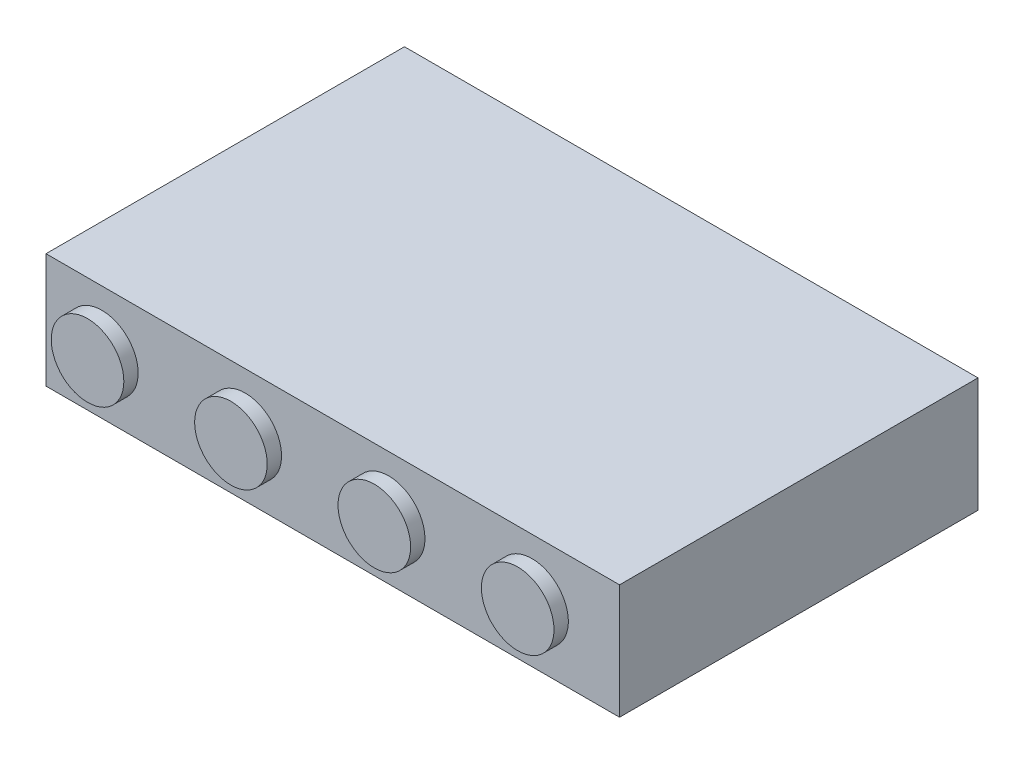
ISO-10303-21;
HEADER;
FILE_DESCRIPTION(('STEP AP214'),'2;1');
FILE_NAME('part.step','',(''),(''),'','','');
FILE_SCHEMA(('AUTOMOTIVE_DESIGN { 1 0 10303 214 1 1 1 1 }'));
ENDSEC;
DATA;
#1=APPLICATION_CONTEXT('core data for automotive mechanical design processes');
#2=APPLICATION_PROTOCOL_DEFINITION('international standard','automotive_design',2000,#1);
#3=PRODUCT_CONTEXT('',#1,'mechanical');
#4=PRODUCT('Part','Part','',(#3));
#5=PRODUCT_RELATED_PRODUCT_CATEGORY('part','',(#4));
#6=PRODUCT_DEFINITION_FORMATION('','',#4);
#7=PRODUCT_DEFINITION_CONTEXT('part definition',#1,'design');
#8=PRODUCT_DEFINITION('design','',#6,#7);
#9=PRODUCT_DEFINITION_SHAPE('','',#8);
#10=(LENGTH_UNIT() NAMED_UNIT(*) SI_UNIT(.MILLI.,.METRE.));
#11=(NAMED_UNIT(*) PLANE_ANGLE_UNIT() SI_UNIT($,.RADIAN.));
#12=(NAMED_UNIT(*) SI_UNIT($,.STERADIAN.) SOLID_ANGLE_UNIT());
#13=UNCERTAINTY_MEASURE_WITH_UNIT(LENGTH_MEASURE(1.E-05),#10,'distance_accuracy_value','');
#14=(GEOMETRIC_REPRESENTATION_CONTEXT(3) GLOBAL_UNCERTAINTY_ASSIGNED_CONTEXT((#13)) GLOBAL_UNIT_ASSIGNED_CONTEXT((#10,
#11,#12)) REPRESENTATION_CONTEXT('',''));
#15=CARTESIAN_POINT('',(0.,0.,0.));
#16=DIRECTION('',(0.,0.,1.));
#17=DIRECTION('',(1.,0.,0.));
#18=AXIS2_PLACEMENT_3D('',#15,#16,#17);
#19=CARTESIAN_POINT('',(-189.36170212766,80.,-111.968085106383));
#20=DIRECTION('',(1.,0.,0.));
#21=DIRECTION('',(0.,0.,-1.));
#22=AXIS2_PLACEMENT_3D('',#19,#20,#21);
#23=PLANE('',#22);
#24=DIRECTION('',(0.,0.,1.));
#25=VECTOR('',#24,1.);
#26=CARTESIAN_POINT('',(-189.36170212766,0.,-111.968085106383));
#27=LINE('',#26,#25);
#28=CARTESIAN_POINT('',(-189.36170212766,0.,-111.968085106383));
#29=VERTEX_POINT('',#28);
#30=CARTESIAN_POINT('',(-189.36170212766,0.,138.031914893617));
#31=VERTEX_POINT('',#30);
#32=EDGE_CURVE('E102',#29,#31,#27,.T.);
#33=ORIENTED_EDGE('',*,*,#32,.T.);
#34=DIRECTION('',(0.,-1.,0.));
#35=VECTOR('',#34,1.);
#36=CARTESIAN_POINT('',(-189.36170212766,80.,138.031914893617));
#37=LINE('',#36,#35);
#38=CARTESIAN_POINT('',(-189.36170212766,80.,138.031914893617));
#39=VERTEX_POINT('',#38);
#40=EDGE_CURVE('E93',#39,#31,#37,.T.);
#41=ORIENTED_EDGE('',*,*,#40,.F.);
#42=DIRECTION('',(0.,0.,1.));
#43=VECTOR('',#42,1.);
#44=CARTESIAN_POINT('',(-189.36170212766,80.,-111.968085106383));
#45=LINE('',#44,#43);
#46=CARTESIAN_POINT('',(-189.36170212766,80.,-111.968085106383));
#47=VERTEX_POINT('',#46);
#48=EDGE_CURVE('E87',#47,#39,#45,.T.);
#49=ORIENTED_EDGE('',*,*,#48,.F.);
#50=DIRECTION('',(0.,-1.,0.));
#51=VECTOR('',#50,1.);
#52=CARTESIAN_POINT('',(-189.36170212766,80.,-111.968085106383));
#53=LINE('',#52,#51);
#54=EDGE_CURVE('E98',#47,#29,#53,.T.);
#55=ORIENTED_EDGE('',*,*,#54,.T.);
#56=EDGE_LOOP('',(#33,#41,#49,#55));
#57=FACE_BOUND('',#56,.T.);
#58=ADVANCED_FACE('F35',(#57),#23,.F.);
#59=CARTESIAN_POINT('',(-189.36170212766,80.,138.031914893617));
#60=DIRECTION('',(0.,0.,-1.));
#61=DIRECTION('',(-1.,0.,0.));
#62=AXIS2_PLACEMENT_3D('',#59,#60,#61);
#63=PLANE('',#62);
#64=CARTESIAN_POINT('',(149.609436624127,40.0000000000042,138.031914893617));
#65=DIRECTION('',(0.,0.,-1.));
#66=DIRECTION('',(-1.,0.,0.));
#67=AXIS2_PLACEMENT_3D('',#64,#65,#66);
#68=CIRCLE('',#67,25.3090722038945);
#69=CARTESIAN_POINT('',(124.300364420233,40.0000000000042,138.031914893617));
#70=VERTEX_POINT('',#69);
#71=EDGE_CURVE('E11',#70,#70,#68,.F.);
#72=ORIENTED_EDGE('',*,*,#71,.F.);
#73=EDGE_LOOP('',(#72));
#74=FACE_BOUND('',#73,.T.);
#75=CARTESIAN_POINT('',(49.6094366241272,40.0000000000028,138.031914893617));
#76=DIRECTION('',(0.,0.,-1.));
#77=DIRECTION('',(-1.,0.,0.));
#78=AXIS2_PLACEMENT_3D('',#75,#76,#77);
#79=CIRCLE('',#78,25.3090722038945);
#80=CARTESIAN_POINT('',(24.3003644202327,40.0000000000028,138.031914893617));
#81=VERTEX_POINT('',#80);
#82=EDGE_CURVE('E43',#81,#81,#79,.F.);
#83=ORIENTED_EDGE('',*,*,#82,.F.);
#84=EDGE_LOOP('',(#83));
#85=FACE_BOUND('',#84,.T.);
#86=CARTESIAN_POINT('',(-50.3905633758728,40.0000000000014,138.031914893617));
#87=DIRECTION('',(0.,0.,-1.));
#88=DIRECTION('',(-1.,0.,0.));
#89=AXIS2_PLACEMENT_3D('',#86,#87,#88);
#90=CIRCLE('',#89,25.3090722038945);
#91=CARTESIAN_POINT('',(-75.6996355797673,40.0000000000014,138.031914893617));
#92=VERTEX_POINT('',#91);
#93=EDGE_CURVE('E118',#92,#92,#90,.F.);
#94=ORIENTED_EDGE('',*,*,#93,.F.);
#95=EDGE_LOOP('',(#94));
#96=FACE_BOUND('',#95,.T.);
#97=CARTESIAN_POINT('',(-150.390563375873,40.,138.031914893617));
#98=DIRECTION('',(0.,0.,-1.));
#99=DIRECTION('',(-1.,0.,0.));
#100=AXIS2_PLACEMENT_3D('',#97,#98,#99);
#101=CIRCLE('',#100,25.3090722038945);
#102=CARTESIAN_POINT('',(-175.699635579767,40.,138.031914893617));
#103=VERTEX_POINT('',#102);
#104=EDGE_CURVE('E115',#103,#103,#101,.F.);
#105=ORIENTED_EDGE('',*,*,#104,.F.);
#106=EDGE_LOOP('',(#105));
#107=FACE_BOUND('',#106,.T.);
#108=DIRECTION('',(1.,0.,0.));
#109=VECTOR('',#108,1.);
#110=CARTESIAN_POINT('',(-189.36170212766,0.,138.031914893617));
#111=LINE('',#110,#109);
#112=CARTESIAN_POINT('',(210.63829787234,0.,138.031914893617));
#113=VERTEX_POINT('',#112);
#114=EDGE_CURVE('E92',#31,#113,#111,.T.);
#115=ORIENTED_EDGE('',*,*,#114,.T.);
#116=DIRECTION('',(0.,-1.,0.));
#117=VECTOR('',#116,1.);
#118=CARTESIAN_POINT('',(210.63829787234,80.,138.031914893617));
#119=LINE('',#118,#117);
#120=CARTESIAN_POINT('',(210.63829787234,80.,138.031914893617));
#121=VERTEX_POINT('',#120);
#122=EDGE_CURVE('E90',#121,#113,#119,.T.);
#123=ORIENTED_EDGE('',*,*,#122,.F.);
#124=DIRECTION('',(1.,0.,0.));
#125=VECTOR('',#124,1.);
#126=CARTESIAN_POINT('',(-189.36170212766,80.,138.031914893617));
#127=LINE('',#126,#125);
#128=EDGE_CURVE('E82',#39,#121,#127,.T.);
#129=ORIENTED_EDGE('',*,*,#128,.F.);
#130=ORIENTED_EDGE('',*,*,#40,.T.);
#131=EDGE_LOOP('',(#115,#123,#129,#130));
#132=FACE_BOUND('',#131,.T.);
#133=ADVANCED_FACE('F91',(#74,#85,#96,#107,#132),#63,.F.);
#134=CARTESIAN_POINT('',(210.63829787234,80.,-111.968085106383));
#135=DIRECTION('',(-1.,0.,0.));
#136=DIRECTION('',(0.,0.,1.));
#137=AXIS2_PLACEMENT_3D('',#134,#135,#136);
#138=PLANE('',#137);
#139=DIRECTION('',(0.,0.,-1.));
#140=VECTOR('',#139,1.);
#141=CARTESIAN_POINT('',(210.63829787234,0.,-111.968085106383));
#142=LINE('',#141,#140);
#143=CARTESIAN_POINT('',(210.63829787234,0.,-111.968085106383));
#144=VERTEX_POINT('',#143);
#145=EDGE_CURVE('E68',#113,#144,#142,.T.);
#146=ORIENTED_EDGE('',*,*,#145,.T.);
#147=DIRECTION('',(0.,-1.,0.));
#148=VECTOR('',#147,1.);
#149=CARTESIAN_POINT('',(210.63829787234,80.,-111.968085106383));
#150=LINE('',#149,#148);
#151=CARTESIAN_POINT('',(210.63829787234,80.,-111.968085106383));
#152=VERTEX_POINT('',#151);
#153=EDGE_CURVE('E94',#152,#144,#150,.T.);
#154=ORIENTED_EDGE('',*,*,#153,.F.);
#155=DIRECTION('',(0.,0.,-1.));
#156=VECTOR('',#155,1.);
#157=CARTESIAN_POINT('',(210.63829787234,80.,-111.968085106383));
#158=LINE('',#157,#156);
#159=EDGE_CURVE('E85',#121,#152,#158,.T.);
#160=ORIENTED_EDGE('',*,*,#159,.F.);
#161=ORIENTED_EDGE('',*,*,#122,.T.);
#162=EDGE_LOOP('',(#146,#154,#160,#161));
#163=FACE_BOUND('',#162,.T.);
#164=ADVANCED_FACE('F96',(#163),#138,.F.);
#165=CARTESIAN_POINT('',(-189.36170212766,80.,-111.968085106383));
#166=DIRECTION('',(0.,0.,1.));
#167=DIRECTION('',(1.,0.,0.));
#168=AXIS2_PLACEMENT_3D('',#165,#166,#167);
#169=PLANE('',#168);
#170=CARTESIAN_POINT('',(10.6382978723403,40.,-111.968085106383));
#171=DIRECTION('',(0.,0.,1.));
#172=DIRECTION('',(1.,0.,0.));
#173=AXIS2_PLACEMENT_3D('',#170,#171,#172);
#174=CIRCLE('',#173,26.3480311949712);
#175=CARTESIAN_POINT('',(36.9863290673116,40.,-111.968085106383));
#176=VERTEX_POINT('',#175);
#177=EDGE_CURVE('E112',#176,#176,#174,.F.);
#178=ORIENTED_EDGE('',*,*,#177,.F.);
#179=EDGE_LOOP('',(#178));
#180=FACE_BOUND('',#179,.T.);
#181=DIRECTION('',(-1.,0.,0.));
#182=VECTOR('',#181,1.);
#183=CARTESIAN_POINT('',(-189.36170212766,0.,-111.968085106383));
#184=LINE('',#183,#182);
#185=EDGE_CURVE('E74',#144,#29,#184,.T.);
#186=ORIENTED_EDGE('',*,*,#185,.T.);
#187=ORIENTED_EDGE('',*,*,#54,.F.);
#188=DIRECTION('',(-1.,0.,0.));
#189=VECTOR('',#188,1.);
#190=CARTESIAN_POINT('',(-189.36170212766,80.,-111.968085106383));
#191=LINE('',#190,#189);
#192=EDGE_CURVE('E51',#152,#47,#191,.T.);
#193=ORIENTED_EDGE('',*,*,#192,.F.);
#194=ORIENTED_EDGE('',*,*,#153,.T.);
#195=EDGE_LOOP('',(#186,#187,#193,#194));
#196=FACE_BOUND('',#195,.T.);
#197=ADVANCED_FACE('F164',(#180,#196),#169,.F.);
#198=CARTESIAN_POINT('',(0.,80.,0.));
#199=DIRECTION('',(0.,1.,0.));
#200=DIRECTION('',(0.,0.,1.));
#201=AXIS2_PLACEMENT_3D('',#198,#199,#200);
#202=PLANE('',#201);
#203=ORIENTED_EDGE('',*,*,#48,.T.);
#204=ORIENTED_EDGE('',*,*,#128,.T.);
#205=ORIENTED_EDGE('',*,*,#159,.T.);
#206=ORIENTED_EDGE('',*,*,#192,.T.);
#207=EDGE_LOOP('',(#203,#204,#205,#206));
#208=FACE_BOUND('',#207,.T.);
#209=ADVANCED_FACE('F83',(#208),#202,.T.);
#210=CARTESIAN_POINT('',(0.,0.,0.));
#211=DIRECTION('',(0.,1.,0.));
#212=DIRECTION('',(0.,0.,1.));
#213=AXIS2_PLACEMENT_3D('',#210,#211,#212);
#214=PLANE('',#213);
#215=ORIENTED_EDGE('',*,*,#32,.F.);
#216=ORIENTED_EDGE('',*,*,#185,.F.);
#217=ORIENTED_EDGE('',*,*,#145,.F.);
#218=ORIENTED_EDGE('',*,*,#114,.F.);
#219=EDGE_LOOP('',(#215,#216,#217,#218));
#220=FACE_BOUND('',#219,.T.);
#221=ADVANCED_FACE('F155',(#220),#214,.F.);
#222=CARTESIAN_POINT('',(10.6382978723403,40.,-121.968085106383));
#223=DIRECTION('',(0.,0.,1.));
#224=DIRECTION('',(1.,0.,0.));
#225=AXIS2_PLACEMENT_3D('',#222,#223,#224);
#226=CYLINDRICAL_SURFACE('',#225,26.3480311949712);
#227=CARTESIAN_POINT('',(10.6382978723403,40.,-121.968085106383));
#228=DIRECTION('',(0.,0.,-1.));
#229=DIRECTION('',(-1.,0.,0.));
#230=AXIS2_PLACEMENT_3D('',#227,#228,#229);
#231=CIRCLE('',#230,26.3480311949712);
#232=CARTESIAN_POINT('',(-15.7097333226309,40.,-121.968085106383));
#233=VERTEX_POINT('',#232);
#234=EDGE_CURVE('E105',#233,#233,#231,.T.);
#235=ORIENTED_EDGE('',*,*,#234,.F.);
#236=EDGE_LOOP('',(#235));
#237=FACE_BOUND('',#236,.T.);
#238=ORIENTED_EDGE('',*,*,#177,.T.);
#239=EDGE_LOOP('',(#238));
#240=FACE_BOUND('',#239,.T.);
#241=ADVANCED_FACE('F145',(#237,#240),#226,.T.);
#242=CARTESIAN_POINT('',(10.6382978723403,40.,-121.968085106383));
#243=DIRECTION('',(0.,0.,-1.));
#244=DIRECTION('',(-1.,0.,0.));
#245=AXIS2_PLACEMENT_3D('',#242,#243,#244);
#246=PLANE('',#245);
#247=ORIENTED_EDGE('',*,*,#234,.T.);
#248=EDGE_LOOP('',(#247));
#249=FACE_BOUND('',#248,.T.);
#250=ADVANCED_FACE('F135',(#249),#246,.T.);
#251=CARTESIAN_POINT('',(-150.390563375873,40.,148.031914893617));
#252=DIRECTION('',(0.,0.,-1.));
#253=DIRECTION('',(-1.,0.,0.));
#254=AXIS2_PLACEMENT_3D('',#251,#252,#253);
#255=CYLINDRICAL_SURFACE('',#254,25.3090722038945);
#256=CARTESIAN_POINT('',(-150.390563375873,40.,148.031914893617));
#257=DIRECTION('',(0.,0.,1.));
#258=DIRECTION('',(1.,0.,0.));
#259=AXIS2_PLACEMENT_3D('',#256,#257,#258);
#260=CIRCLE('',#259,25.3090722038945);
#261=CARTESIAN_POINT('',(-125.081491171978,40.,148.031914893617));
#262=VERTEX_POINT('',#261);
#263=EDGE_CURVE('E280',#262,#262,#260,.T.);
#264=ORIENTED_EDGE('',*,*,#263,.F.);
#265=EDGE_LOOP('',(#264));
#266=FACE_BOUND('',#265,.T.);
#267=ORIENTED_EDGE('',*,*,#104,.T.);
#268=EDGE_LOOP('',(#267));
#269=FACE_BOUND('',#268,.T.);
#270=ADVANCED_FACE('F132',(#266,#269),#255,.T.);
#271=CARTESIAN_POINT('',(-150.390563375873,40.,148.031914893617));
#272=DIRECTION('',(0.,0.,1.));
#273=DIRECTION('',(1.,0.,0.));
#274=AXIS2_PLACEMENT_3D('',#271,#272,#273);
#275=PLANE('',#274);
#276=ORIENTED_EDGE('',*,*,#263,.T.);
#277=EDGE_LOOP('',(#276));
#278=FACE_BOUND('',#277,.T.);
#279=ADVANCED_FACE('F134',(#278),#275,.T.);
#280=CARTESIAN_POINT('',(-50.3905633758728,40.0000000000014,148.031914893617));
#281=DIRECTION('',(0.,0.,-1.));
#282=DIRECTION('',(-1.,0.,0.));
#283=AXIS2_PLACEMENT_3D('',#280,#281,#282);
#284=CYLINDRICAL_SURFACE('',#283,25.3090722038945);
#285=CARTESIAN_POINT('',(-50.3905633758728,40.0000000000014,148.031914893617));
#286=DIRECTION('',(0.,0.,1.));
#287=DIRECTION('',(1.,0.,0.));
#288=AXIS2_PLACEMENT_3D('',#285,#286,#287);
#289=CIRCLE('',#288,25.3090722038945);
#290=CARTESIAN_POINT('',(-25.0814911719783,40.0000000000014,148.031914893617));
#291=VERTEX_POINT('',#290);
#292=EDGE_CURVE('E275',#291,#291,#289,.T.);
#293=ORIENTED_EDGE('',*,*,#292,.F.);
#294=EDGE_LOOP('',(#293));
#295=FACE_BOUND('',#294,.T.);
#296=ORIENTED_EDGE('',*,*,#93,.T.);
#297=EDGE_LOOP('',(#296));
#298=FACE_BOUND('',#297,.T.);
#299=ADVANCED_FACE('F142',(#295,#298),#284,.T.);
#300=CARTESIAN_POINT('',(-50.3905633758728,40.0000000000014,148.031914893617));
#301=DIRECTION('',(0.,0.,1.));
#302=DIRECTION('',(1.,0.,0.));
#303=AXIS2_PLACEMENT_3D('',#300,#301,#302);
#304=PLANE('',#303);
#305=ORIENTED_EDGE('',*,*,#292,.T.);
#306=EDGE_LOOP('',(#305));
#307=FACE_BOUND('',#306,.T.);
#308=ADVANCED_FACE('F216',(#307),#304,.T.);
#309=CARTESIAN_POINT('',(49.6094366241272,40.0000000000028,148.031914893617));
#310=DIRECTION('',(0.,0.,-1.));
#311=DIRECTION('',(-1.,0.,0.));
#312=AXIS2_PLACEMENT_3D('',#309,#310,#311);
#313=CYLINDRICAL_SURFACE('',#312,25.3090722038945);
#314=CARTESIAN_POINT('',(49.6094366241272,40.0000000000028,148.031914893617));
#315=DIRECTION('',(0.,0.,1.));
#316=DIRECTION('',(1.,0.,0.));
#317=AXIS2_PLACEMENT_3D('',#314,#315,#316);
#318=CIRCLE('',#317,25.3090722038945);
#319=CARTESIAN_POINT('',(74.9185088280217,40.0000000000028,148.031914893617));
#320=VERTEX_POINT('',#319);
#321=EDGE_CURVE('E272',#320,#320,#318,.T.);
#322=ORIENTED_EDGE('',*,*,#321,.F.);
#323=EDGE_LOOP('',(#322));
#324=FACE_BOUND('',#323,.T.);
#325=ORIENTED_EDGE('',*,*,#82,.T.);
#326=EDGE_LOOP('',(#325));
#327=FACE_BOUND('',#326,.T.);
#328=ADVANCED_FACE('F123',(#324,#327),#313,.T.);
#329=CARTESIAN_POINT('',(49.6094366241272,40.0000000000028,148.031914893617));
#330=DIRECTION('',(0.,0.,1.));
#331=DIRECTION('',(1.,0.,0.));
#332=AXIS2_PLACEMENT_3D('',#329,#330,#331);
#333=PLANE('',#332);
#334=ORIENTED_EDGE('',*,*,#321,.T.);
#335=EDGE_LOOP('',(#334));
#336=FACE_BOUND('',#335,.T.);
#337=ADVANCED_FACE('F233',(#336),#333,.T.);
#338=CARTESIAN_POINT('',(149.609436624127,40.0000000000042,148.031914893617));
#339=DIRECTION('',(0.,0.,-1.));
#340=DIRECTION('',(-1.,0.,0.));
#341=AXIS2_PLACEMENT_3D('',#338,#339,#340);
#342=CYLINDRICAL_SURFACE('',#341,25.3090722038945);
#343=CARTESIAN_POINT('',(149.609436624127,40.0000000000042,148.031914893617));
#344=DIRECTION('',(0.,0.,1.));
#345=DIRECTION('',(1.,0.,0.));
#346=AXIS2_PLACEMENT_3D('',#343,#344,#345);
#347=CIRCLE('',#346,25.3090722038945);
#348=CARTESIAN_POINT('',(174.918508828022,40.0000000000042,148.031914893617));
#349=VERTEX_POINT('',#348);
#350=EDGE_CURVE('E271',#349,#349,#347,.T.);
#351=ORIENTED_EDGE('',*,*,#350,.F.);
#352=EDGE_LOOP('',(#351));
#353=FACE_BOUND('',#352,.T.);
#354=ORIENTED_EDGE('',*,*,#71,.T.);
#355=EDGE_LOOP('',(#354));
#356=FACE_BOUND('',#355,.T.);
#357=ADVANCED_FACE('F242',(#353,#356),#342,.T.);
#358=CARTESIAN_POINT('',(149.609436624127,40.0000000000042,148.031914893617));
#359=DIRECTION('',(0.,0.,1.));
#360=DIRECTION('',(1.,0.,0.));
#361=AXIS2_PLACEMENT_3D('',#358,#359,#360);
#362=PLANE('',#361);
#363=ORIENTED_EDGE('',*,*,#350,.T.);
#364=EDGE_LOOP('',(#363));
#365=FACE_BOUND('',#364,.T.);
#366=ADVANCED_FACE('F251',(#365),#362,.T.);
#367=CLOSED_SHELL('',(#58,#133,#164,#197,#209,#221,#241,#250,#270,#279,#299,#308,#328,#337,#357,#366));
#368=MANIFOLD_SOLID_BREP('B2',#367);
#369=ADVANCED_BREP_SHAPE_REPRESENTATION('',(#18,#368),#14);
#370=SHAPE_DEFINITION_REPRESENTATION(#9,#369);
ENDSEC;
END-ISO-10303-21;
